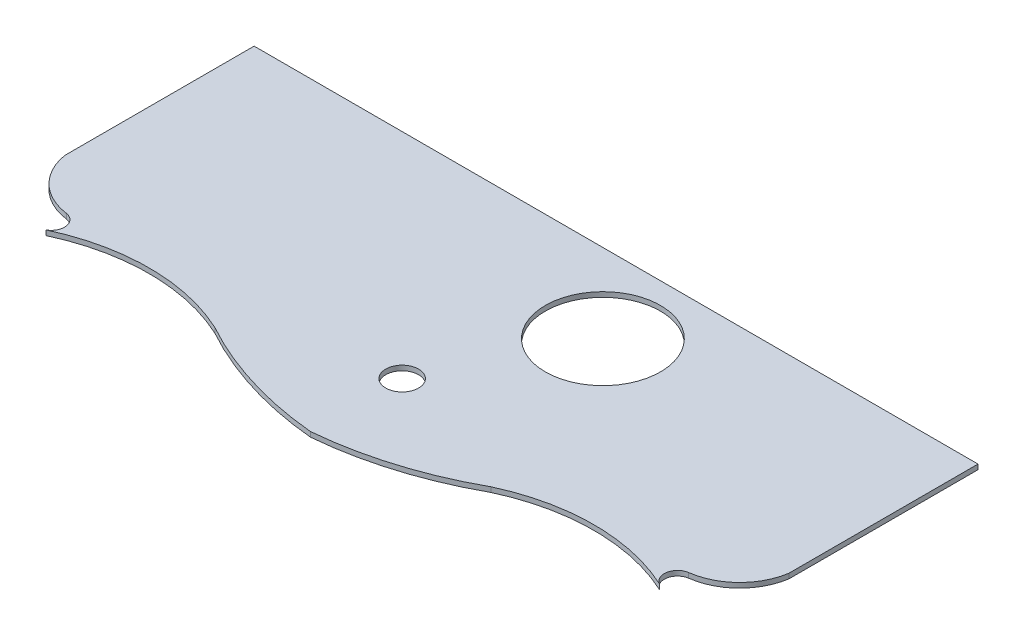
ISO-10303-21;
HEADER;
FILE_DESCRIPTION(('STEP AP214'),'2;1');
FILE_NAME('part.step','',(''),(''),'','','');
FILE_SCHEMA(('AUTOMOTIVE_DESIGN { 1 0 10303 214 1 1 1 1 }'));
ENDSEC;
DATA;
#1=APPLICATION_CONTEXT('core data for automotive mechanical design processes');
#2=APPLICATION_PROTOCOL_DEFINITION('international standard','automotive_design',2000,#1);
#3=PRODUCT_CONTEXT('',#1,'mechanical');
#4=PRODUCT('Part','Part','',(#3));
#5=PRODUCT_RELATED_PRODUCT_CATEGORY('part','',(#4));
#6=PRODUCT_DEFINITION_FORMATION('','',#4);
#7=PRODUCT_DEFINITION_CONTEXT('part definition',#1,'design');
#8=PRODUCT_DEFINITION('design','',#6,#7);
#9=PRODUCT_DEFINITION_SHAPE('','',#8);
#10=(LENGTH_UNIT() NAMED_UNIT(*) SI_UNIT(.MILLI.,.METRE.));
#11=(NAMED_UNIT(*) PLANE_ANGLE_UNIT() SI_UNIT($,.RADIAN.));
#12=(NAMED_UNIT(*) SI_UNIT($,.STERADIAN.) SOLID_ANGLE_UNIT());
#13=UNCERTAINTY_MEASURE_WITH_UNIT(LENGTH_MEASURE(1.E-05),#10,'distance_accuracy_value','');
#14=(GEOMETRIC_REPRESENTATION_CONTEXT(3) GLOBAL_UNCERTAINTY_ASSIGNED_CONTEXT((#13)) GLOBAL_UNIT_ASSIGNED_CONTEXT((#10,
#11,#12)) REPRESENTATION_CONTEXT('',''));
#15=CARTESIAN_POINT('',(0.,0.,0.));
#16=DIRECTION('',(0.,0.,1.));
#17=DIRECTION('',(1.,0.,0.));
#18=AXIS2_PLACEMENT_3D('',#15,#16,#17);
#19=CARTESIAN_POINT('',(0.,262.801123672656,15.));
#20=DIRECTION('',(0.,-1.,0.));
#21=DIRECTION('',(0.,0.,-1.));
#22=AXIS2_PLACEMENT_3D('',#19,#20,#21);
#23=CYLINDRICAL_SURFACE('',#22,5.);
#24=CARTESIAN_POINT('',(0.,22.5,15.));
#25=DIRECTION('',(0.,1.,0.));
#26=DIRECTION('',(0.,0.,1.));
#27=AXIS2_PLACEMENT_3D('',#24,#25,#26);
#28=CIRCLE('',#27,5.);
#29=CARTESIAN_POINT('',(0.,22.5,20.));
#30=VERTEX_POINT('',#29);
#31=EDGE_CURVE('E173',#30,#30,#28,.T.);
#32=ORIENTED_EDGE('',*,*,#31,.F.);
#33=EDGE_LOOP('',(#32));
#34=FACE_BOUND('',#33,.T.);
#35=CARTESIAN_POINT('',(0.,24.,15.));
#36=DIRECTION('',(0.,1.,0.));
#37=DIRECTION('',(0.,0.,1.));
#38=AXIS2_PLACEMENT_3D('',#35,#36,#37);
#39=CIRCLE('',#38,5.);
#40=CARTESIAN_POINT('',(0.,24.,20.));
#41=VERTEX_POINT('',#40);
#42=EDGE_CURVE('E142',#41,#41,#39,.T.);
#43=ORIENTED_EDGE('',*,*,#42,.T.);
#44=EDGE_LOOP('',(#43));
#45=FACE_BOUND('',#44,.T.);
#46=ADVANCED_FACE('F39',(#34,#45),#23,.F.);
#47=CARTESIAN_POINT('',(-110.,262.801123672656,-50.));
#48=DIRECTION('',(0.,0.,1.));
#49=DIRECTION('',(1.,0.,0.));
#50=AXIS2_PLACEMENT_3D('',#47,#48,#49);
#51=PLANE('',#50);
#52=DIRECTION('',(-1.,0.,0.));
#53=VECTOR('',#52,1.);
#54=CARTESIAN_POINT('',(-110.,24.,-50.));
#55=LINE('',#54,#53);
#56=CARTESIAN_POINT('',(110.,24.,-50.));
#57=VERTEX_POINT('',#56);
#58=CARTESIAN_POINT('',(-110.,24.,-50.));
#59=VERTEX_POINT('',#58);
#60=EDGE_CURVE('E127',#57,#59,#55,.T.);
#61=ORIENTED_EDGE('',*,*,#60,.F.);
#62=DIRECTION('',(0.,-1.,0.));
#63=VECTOR('',#62,1.);
#64=CARTESIAN_POINT('',(110.,262.801123672656,-50.));
#65=LINE('',#64,#63);
#66=CARTESIAN_POINT('',(110.,22.5,-50.));
#67=VERTEX_POINT('',#66);
#68=EDGE_CURVE('E54',#57,#67,#65,.T.);
#69=ORIENTED_EDGE('',*,*,#68,.T.);
#70=DIRECTION('',(-1.,0.,0.));
#71=VECTOR('',#70,1.);
#72=CARTESIAN_POINT('',(-110.,22.5,-50.));
#73=LINE('',#72,#71);
#74=CARTESIAN_POINT('',(-110.,22.5,-50.));
#75=VERTEX_POINT('',#74);
#76=EDGE_CURVE('E129',#67,#75,#73,.T.);
#77=ORIENTED_EDGE('',*,*,#76,.T.);
#78=DIRECTION('',(0.,-1.,0.));
#79=VECTOR('',#78,1.);
#80=CARTESIAN_POINT('',(-110.,262.801123672656,-50.));
#81=LINE('',#80,#79);
#82=EDGE_CURVE('E125',#59,#75,#81,.T.);
#83=ORIENTED_EDGE('',*,*,#82,.F.);
#84=EDGE_LOOP('',(#61,#69,#77,#83));
#85=FACE_BOUND('',#84,.T.);
#86=ADVANCED_FACE('F122',(#85),#51,.F.);
#87=CARTESIAN_POINT('',(110.,262.801123672656,-50.));
#88=DIRECTION('',(-1.,0.,0.));
#89=DIRECTION('',(0.,0.,1.));
#90=AXIS2_PLACEMENT_3D('',#87,#88,#89);
#91=PLANE('',#90);
#92=DIRECTION('',(0.,0.,-1.));
#93=VECTOR('',#92,1.);
#94=CARTESIAN_POINT('',(110.,24.,-50.));
#95=LINE('',#94,#93);
#96=CARTESIAN_POINT('',(110.,24.,7.50000000000001));
#97=VERTEX_POINT('',#96);
#98=EDGE_CURVE('E143',#97,#57,#95,.T.);
#99=ORIENTED_EDGE('',*,*,#98,.F.);
#100=DIRECTION('',(0.,-1.,0.));
#101=VECTOR('',#100,1.);
#102=CARTESIAN_POINT('',(110.,262.801123672656,7.50000000000001));
#103=LINE('',#102,#101);
#104=CARTESIAN_POINT('',(110.,22.5,7.50000000000001));
#105=VERTEX_POINT('',#104);
#106=EDGE_CURVE('E204',#97,#105,#103,.T.);
#107=ORIENTED_EDGE('',*,*,#106,.T.);
#108=DIRECTION('',(0.,0.,-1.));
#109=VECTOR('',#108,1.);
#110=CARTESIAN_POINT('',(110.,22.5,-50.));
#111=LINE('',#110,#109);
#112=EDGE_CURVE('E199',#105,#67,#111,.T.);
#113=ORIENTED_EDGE('',*,*,#112,.T.);
#114=ORIENTED_EDGE('',*,*,#68,.F.);
#115=EDGE_LOOP('',(#99,#107,#113,#114));
#116=FACE_BOUND('',#115,.T.);
#117=ADVANCED_FACE('F252',(#116),#91,.F.);
#118=CARTESIAN_POINT('',(92.2220271706998,262.801123672656,4.68154615424299));
#119=DIRECTION('',(0.,-1.,0.));
#120=DIRECTION('',(0.,0.,-1.));
#121=AXIS2_PLACEMENT_3D('',#118,#119,#120);
#122=CYLINDRICAL_SURFACE('',#121,18.);
#123=CARTESIAN_POINT('',(92.2220271706998,24.,4.68154615424299));
#124=DIRECTION('',(0.,1.,0.));
#125=DIRECTION('',(0.,0.,1.));
#126=AXIS2_PLACEMENT_3D('',#123,#124,#125);
#127=CIRCLE('',#126,18.);
#128=CARTESIAN_POINT('',(94.5,24.,22.5368209992004));
#129=VERTEX_POINT('',#128);
#130=EDGE_CURVE('E145',#129,#97,#127,.T.);
#131=ORIENTED_EDGE('',*,*,#130,.F.);
#132=DIRECTION('',(0.,-1.,0.));
#133=VECTOR('',#132,1.);
#134=CARTESIAN_POINT('',(94.5,262.801123672656,22.5368209992004));
#135=LINE('',#134,#133);
#136=CARTESIAN_POINT('',(94.5,22.5,22.5368209992004));
#137=VERTEX_POINT('',#136);
#138=EDGE_CURVE('E206',#129,#137,#135,.T.);
#139=ORIENTED_EDGE('',*,*,#138,.T.);
#140=CARTESIAN_POINT('',(92.2220271706998,22.5,4.68154615424299));
#141=DIRECTION('',(0.,1.,0.));
#142=DIRECTION('',(0.,0.,-1.));
#143=AXIS2_PLACEMENT_3D('',#140,#141,#142);
#144=CIRCLE('',#143,18.);
#145=EDGE_CURVE('E197',#137,#105,#144,.T.);
#146=ORIENTED_EDGE('',*,*,#145,.T.);
#147=ORIENTED_EDGE('',*,*,#106,.F.);
#148=EDGE_LOOP('',(#131,#139,#146,#147));
#149=FACE_BOUND('',#148,.T.);
#150=ADVANCED_FACE('F247',(#149),#122,.T.);
#151=CARTESIAN_POINT('',(95.1559154698416,262.801123672656,26.4829496841931));
#152=DIRECTION('',(0.,-1.,0.));
#153=DIRECTION('',(0.,0.,-1.));
#154=AXIS2_PLACEMENT_3D('',#151,#152,#153);
#155=CYLINDRICAL_SURFACE('',#154,4.00026957867828);
#156=CARTESIAN_POINT('',(95.1559154698416,24.,26.4829496841931));
#157=DIRECTION('',(0.,1.,0.));
#158=DIRECTION('',(0.,0.,1.));
#159=AXIS2_PLACEMENT_3D('',#156,#157,#158);
#160=CIRCLE('',#159,4.00026957867828);
#161=CARTESIAN_POINT('',(93.25,24.,30.));
#162=VERTEX_POINT('',#161);
#163=EDGE_CURVE('E147',#162,#129,#160,.F.);
#164=ORIENTED_EDGE('',*,*,#163,.F.);
#165=DIRECTION('',(0.,-1.,0.));
#166=VECTOR('',#165,1.);
#167=CARTESIAN_POINT('',(93.25,262.801123672656,30.));
#168=LINE('',#167,#166);
#169=CARTESIAN_POINT('',(93.25,22.5,30.));
#170=VERTEX_POINT('',#169);
#171=EDGE_CURVE('E208',#162,#170,#168,.T.);
#172=ORIENTED_EDGE('',*,*,#171,.T.);
#173=CARTESIAN_POINT('',(95.1559154698416,22.5,26.4829496841931));
#174=DIRECTION('',(0.,-1.,0.));
#175=DIRECTION('',(0.,0.,1.));
#176=AXIS2_PLACEMENT_3D('',#173,#174,#175);
#177=CIRCLE('',#176,4.00026957867828);
#178=EDGE_CURVE('E192',#170,#137,#177,.T.);
#179=ORIENTED_EDGE('',*,*,#178,.T.);
#180=ORIENTED_EDGE('',*,*,#138,.F.);
#181=EDGE_LOOP('',(#164,#172,#179,#180));
#182=FACE_BOUND('',#181,.T.);
#183=ADVANCED_FACE('F246',(#182),#155,.F.);
#184=CARTESIAN_POINT('',(67.6062576231202,262.801123672656,85.029602130527));
#185=DIRECTION('',(0.,-1.,0.));
#186=DIRECTION('',(0.,0.,-1.));
#187=AXIS2_PLACEMENT_3D('',#184,#185,#186);
#188=CYLINDRICAL_SURFACE('',#187,60.7112727072649);
#189=CARTESIAN_POINT('',(67.6062576231202,24.,85.029602130527));
#190=DIRECTION('',(0.,1.,0.));
#191=DIRECTION('',(0.,0.,1.));
#192=AXIS2_PLACEMENT_3D('',#189,#190,#191);
#193=CIRCLE('',#192,60.7112727072649);
#194=CARTESIAN_POINT('',(41.9625152462405,24.,30.));
#195=VERTEX_POINT('',#194);
#196=EDGE_CURVE('E153',#195,#162,#193,.F.);
#197=ORIENTED_EDGE('',*,*,#196,.F.);
#198=DIRECTION('',(0.,-1.,0.));
#199=VECTOR('',#198,1.);
#200=CARTESIAN_POINT('',(41.9625152462405,262.801123672656,30.));
#201=LINE('',#200,#199);
#202=CARTESIAN_POINT('',(41.9625152462405,22.5,30.));
#203=VERTEX_POINT('',#202);
#204=EDGE_CURVE('E209',#195,#203,#201,.T.);
#205=ORIENTED_EDGE('',*,*,#204,.T.);
#206=CARTESIAN_POINT('',(67.6062576231202,22.5,85.029602130527));
#207=DIRECTION('',(0.,-1.,0.));
#208=DIRECTION('',(0.,0.,1.));
#209=AXIS2_PLACEMENT_3D('',#206,#207,#208);
#210=CIRCLE('',#209,60.7112727072649);
#211=EDGE_CURVE('E191',#203,#170,#210,.T.);
#212=ORIENTED_EDGE('',*,*,#211,.T.);
#213=ORIENTED_EDGE('',*,*,#171,.F.);
#214=EDGE_LOOP('',(#197,#205,#212,#213));
#215=FACE_BOUND('',#214,.T.);
#216=ADVANCED_FACE('F243',(#215),#188,.F.);
#217=CARTESIAN_POINT('',(-9.52483016864245,262.801123672656,-62.9793470940987));
#218=DIRECTION('',(0.,-1.,0.));
#219=DIRECTION('',(0.,0.,-1.));
#220=AXIS2_PLACEMENT_3D('',#217,#218,#219);
#221=CYLINDRICAL_SURFACE('',#220,106.283139415038);
#222=CARTESIAN_POINT('',(-9.52483016864245,24.,-62.9793470940987));
#223=DIRECTION('',(0.,1.,0.));
#224=DIRECTION('',(0.,0.,1.));
#225=AXIS2_PLACEMENT_3D('',#222,#223,#224);
#226=CIRCLE('',#225,106.283139415038);
#227=CARTESIAN_POINT('',(0.,24.,42.8761361562973));
#228=VERTEX_POINT('',#227);
#229=EDGE_CURVE('E156',#228,#195,#226,.T.);
#230=ORIENTED_EDGE('',*,*,#229,.F.);
#231=DIRECTION('',(0.,-1.,0.));
#232=VECTOR('',#231,1.);
#233=CARTESIAN_POINT('',(0.,262.801123672656,42.8761361562973));
#234=LINE('',#233,#232);
#235=CARTESIAN_POINT('',(0.,22.5,42.8761361562973));
#236=VERTEX_POINT('',#235);
#237=EDGE_CURVE('E215',#228,#236,#234,.T.);
#238=ORIENTED_EDGE('',*,*,#237,.T.);
#239=CARTESIAN_POINT('',(-9.52483016864245,22.5,-62.9793470940987));
#240=DIRECTION('',(0.,1.,0.));
#241=DIRECTION('',(0.,0.,-1.));
#242=AXIS2_PLACEMENT_3D('',#239,#240,#241);
#243=CIRCLE('',#242,106.283139415038);
#244=EDGE_CURVE('E186',#236,#203,#243,.T.);
#245=ORIENTED_EDGE('',*,*,#244,.T.);
#246=ORIENTED_EDGE('',*,*,#204,.F.);
#247=EDGE_LOOP('',(#230,#238,#245,#246));
#248=FACE_BOUND('',#247,.T.);
#249=ADVANCED_FACE('F240',(#248),#221,.T.);
#250=CARTESIAN_POINT('',(9.52483016864245,262.801123672656,-62.9793470940987));
#251=DIRECTION('',(0.,-1.,0.));
#252=DIRECTION('',(0.,0.,-1.));
#253=AXIS2_PLACEMENT_3D('',#250,#251,#252);
#254=CYLINDRICAL_SURFACE('',#253,106.283139415038);
#255=CARTESIAN_POINT('',(9.52483016864245,24.,-62.9793470940987));
#256=DIRECTION('',(0.,1.,0.));
#257=DIRECTION('',(0.,0.,1.));
#258=AXIS2_PLACEMENT_3D('',#255,#256,#257);
#259=CIRCLE('',#258,106.283139415038);
#260=CARTESIAN_POINT('',(-41.9625152462405,24.,30.));
#261=VERTEX_POINT('',#260);
#262=EDGE_CURVE('E157',#261,#228,#259,.T.);
#263=ORIENTED_EDGE('',*,*,#262,.F.);
#264=DIRECTION('',(0.,-1.,0.));
#265=VECTOR('',#264,1.);
#266=CARTESIAN_POINT('',(-41.9625152462405,262.801123672656,30.));
#267=LINE('',#266,#265);
#268=CARTESIAN_POINT('',(-41.9625152462405,22.5,30.));
#269=VERTEX_POINT('',#268);
#270=EDGE_CURVE('E212',#261,#269,#267,.T.);
#271=ORIENTED_EDGE('',*,*,#270,.T.);
#272=CARTESIAN_POINT('',(9.52483016864245,22.5,-62.9793470940987));
#273=DIRECTION('',(0.,1.,0.));
#274=DIRECTION('',(0.,0.,1.));
#275=AXIS2_PLACEMENT_3D('',#272,#273,#274);
#276=CIRCLE('',#275,106.283139415038);
#277=EDGE_CURVE('E183',#269,#236,#276,.T.);
#278=ORIENTED_EDGE('',*,*,#277,.T.);
#279=ORIENTED_EDGE('',*,*,#237,.F.);
#280=EDGE_LOOP('',(#263,#271,#278,#279));
#281=FACE_BOUND('',#280,.T.);
#282=ADVANCED_FACE('F234',(#281),#254,.T.);
#283=CARTESIAN_POINT('',(-67.6062576231202,262.801123672656,85.029602130527));
#284=DIRECTION('',(0.,-1.,0.));
#285=DIRECTION('',(0.,0.,-1.));
#286=AXIS2_PLACEMENT_3D('',#283,#284,#285);
#287=CYLINDRICAL_SURFACE('',#286,60.7112727072649);
#288=CARTESIAN_POINT('',(-67.6062576231202,24.,85.029602130527));
#289=DIRECTION('',(0.,1.,0.));
#290=DIRECTION('',(0.,0.,1.));
#291=AXIS2_PLACEMENT_3D('',#288,#289,#290);
#292=CIRCLE('',#291,60.7112727072649);
#293=CARTESIAN_POINT('',(-93.25,24.,30.));
#294=VERTEX_POINT('',#293);
#295=EDGE_CURVE('E165',#294,#261,#292,.F.);
#296=ORIENTED_EDGE('',*,*,#295,.F.);
#297=DIRECTION('',(0.,-1.,0.));
#298=VECTOR('',#297,1.);
#299=CARTESIAN_POINT('',(-93.25,262.801123672656,30.));
#300=LINE('',#299,#298);
#301=CARTESIAN_POINT('',(-93.25,22.5,30.));
#302=VERTEX_POINT('',#301);
#303=EDGE_CURVE('E216',#294,#302,#300,.T.);
#304=ORIENTED_EDGE('',*,*,#303,.T.);
#305=CARTESIAN_POINT('',(-67.6062576231202,22.5,85.029602130527));
#306=DIRECTION('',(0.,-1.,0.));
#307=DIRECTION('',(0.,0.,1.));
#308=AXIS2_PLACEMENT_3D('',#305,#306,#307);
#309=CIRCLE('',#308,60.7112727072649);
#310=EDGE_CURVE('E185',#302,#269,#309,.T.);
#311=ORIENTED_EDGE('',*,*,#310,.T.);
#312=ORIENTED_EDGE('',*,*,#270,.F.);
#313=EDGE_LOOP('',(#296,#304,#311,#312));
#314=FACE_BOUND('',#313,.T.);
#315=ADVANCED_FACE('F235',(#314),#287,.F.);
#316=CARTESIAN_POINT('',(-95.1559154698416,262.801123672656,26.4829496841931));
#317=DIRECTION('',(0.,-1.,0.));
#318=DIRECTION('',(0.,0.,-1.));
#319=AXIS2_PLACEMENT_3D('',#316,#317,#318);
#320=CYLINDRICAL_SURFACE('',#319,4.0002695786783);
#321=CARTESIAN_POINT('',(-95.1559154698416,24.,26.4829496841931));
#322=DIRECTION('',(0.,1.,0.));
#323=DIRECTION('',(0.,0.,1.));
#324=AXIS2_PLACEMENT_3D('',#321,#322,#323);
#325=CIRCLE('',#324,4.0002695786783);
#326=CARTESIAN_POINT('',(-94.5,24.,22.5368209992005));
#327=VERTEX_POINT('',#326);
#328=EDGE_CURVE('E164',#327,#294,#325,.F.);
#329=ORIENTED_EDGE('',*,*,#328,.F.);
#330=DIRECTION('',(0.,-1.,0.));
#331=VECTOR('',#330,1.);
#332=CARTESIAN_POINT('',(-94.5,262.801123672656,22.5368209992005));
#333=LINE('',#332,#331);
#334=CARTESIAN_POINT('',(-94.5,22.5,22.5368209992005));
#335=VERTEX_POINT('',#334);
#336=EDGE_CURVE('E48',#327,#335,#333,.T.);
#337=ORIENTED_EDGE('',*,*,#336,.T.);
#338=CARTESIAN_POINT('',(-95.1559154698416,22.5,26.4829496841931));
#339=DIRECTION('',(0.,-1.,0.));
#340=DIRECTION('',(0.,0.,-1.));
#341=AXIS2_PLACEMENT_3D('',#338,#339,#340);
#342=CIRCLE('',#341,4.0002695786783);
#343=EDGE_CURVE('E177',#335,#302,#342,.T.);
#344=ORIENTED_EDGE('',*,*,#343,.T.);
#345=ORIENTED_EDGE('',*,*,#303,.F.);
#346=EDGE_LOOP('',(#329,#337,#344,#345));
#347=FACE_BOUND('',#346,.T.);
#348=ADVANCED_FACE('F218',(#347),#320,.F.);
#349=CARTESIAN_POINT('',(-92.2220271706998,262.801123672656,4.68154615424301));
#350=DIRECTION('',(0.,-1.,0.));
#351=DIRECTION('',(0.,0.,-1.));
#352=AXIS2_PLACEMENT_3D('',#349,#350,#351);
#353=CYLINDRICAL_SURFACE('',#352,18.);
#354=CARTESIAN_POINT('',(-92.2220271706998,24.,4.68154615424301));
#355=DIRECTION('',(0.,1.,0.));
#356=DIRECTION('',(0.,0.,1.));
#357=AXIS2_PLACEMENT_3D('',#354,#355,#356);
#358=CIRCLE('',#357,18.);
#359=CARTESIAN_POINT('',(-110.,24.,7.5));
#360=VERTEX_POINT('',#359);
#361=EDGE_CURVE('E65',#360,#327,#358,.T.);
#362=ORIENTED_EDGE('',*,*,#361,.F.);
#363=DIRECTION('',(0.,-1.,0.));
#364=VECTOR('',#363,1.);
#365=CARTESIAN_POINT('',(-110.,262.801123672656,7.5));
#366=LINE('',#365,#364);
#367=CARTESIAN_POINT('',(-110.,22.5,7.5));
#368=VERTEX_POINT('',#367);
#369=EDGE_CURVE('E11',#360,#368,#366,.T.);
#370=ORIENTED_EDGE('',*,*,#369,.T.);
#371=CARTESIAN_POINT('',(-92.2220271706998,22.5,4.68154615424301));
#372=DIRECTION('',(0.,1.,0.));
#373=DIRECTION('',(0.,0.,1.));
#374=AXIS2_PLACEMENT_3D('',#371,#372,#373);
#375=CIRCLE('',#374,18.);
#376=EDGE_CURVE('E176',#368,#335,#375,.T.);
#377=ORIENTED_EDGE('',*,*,#376,.T.);
#378=ORIENTED_EDGE('',*,*,#336,.F.);
#379=EDGE_LOOP('',(#362,#370,#377,#378));
#380=FACE_BOUND('',#379,.T.);
#381=ADVANCED_FACE('F221',(#380),#353,.T.);
#382=CARTESIAN_POINT('',(-110.,262.801123672656,-50.));
#383=DIRECTION('',(1.,0.,0.));
#384=DIRECTION('',(0.,0.,-1.));
#385=AXIS2_PLACEMENT_3D('',#382,#383,#384);
#386=PLANE('',#385);
#387=DIRECTION('',(0.,0.,1.));
#388=VECTOR('',#387,1.);
#389=CARTESIAN_POINT('',(-110.,24.,-50.));
#390=LINE('',#389,#388);
#391=EDGE_CURVE('E134',#59,#360,#390,.T.);
#392=ORIENTED_EDGE('',*,*,#391,.F.);
#393=ORIENTED_EDGE('',*,*,#82,.T.);
#394=DIRECTION('',(0.,0.,1.));
#395=VECTOR('',#394,1.);
#396=CARTESIAN_POINT('',(-110.,22.5,-50.));
#397=LINE('',#396,#395);
#398=EDGE_CURVE('E172',#75,#368,#397,.T.);
#399=ORIENTED_EDGE('',*,*,#398,.T.);
#400=ORIENTED_EDGE('',*,*,#369,.F.);
#401=EDGE_LOOP('',(#392,#393,#399,#400));
#402=FACE_BOUND('',#401,.T.);
#403=ADVANCED_FACE('F41',(#402),#386,.F.);
#404=CARTESIAN_POINT('',(-92.2220271706998,22.5,4.68154615424301));
#405=DIRECTION('',(0.,1.,0.));
#406=DIRECTION('',(0.,0.,1.));
#407=AXIS2_PLACEMENT_3D('',#404,#405,#406);
#408=PLANE('',#407);
#409=ORIENTED_EDGE('',*,*,#398,.F.);
#410=ORIENTED_EDGE('',*,*,#76,.F.);
#411=ORIENTED_EDGE('',*,*,#112,.F.);
#412=ORIENTED_EDGE('',*,*,#145,.F.);
#413=ORIENTED_EDGE('',*,*,#178,.F.);
#414=ORIENTED_EDGE('',*,*,#211,.F.);
#415=ORIENTED_EDGE('',*,*,#244,.F.);
#416=ORIENTED_EDGE('',*,*,#277,.F.);
#417=ORIENTED_EDGE('',*,*,#310,.F.);
#418=ORIENTED_EDGE('',*,*,#343,.F.);
#419=ORIENTED_EDGE('',*,*,#376,.F.);
#420=EDGE_LOOP('',(#409,#410,#411,#412,#413,#414,#415,#416,#417,#418,#419));
#421=FACE_BOUND('',#420,.T.);
#422=ORIENTED_EDGE('',*,*,#31,.T.);
#423=EDGE_LOOP('',(#422));
#424=FACE_BOUND('',#423,.T.);
#425=CARTESIAN_POINT('',(20.,22.5,-26.));
#426=DIRECTION('',(0.,1.,0.));
#427=DIRECTION('',(0.,0.,1.));
#428=AXIS2_PLACEMENT_3D('',#425,#426,#427);
#429=CIRCLE('',#428,17.5);
#430=CARTESIAN_POINT('',(20.,22.5,-8.49999999999999));
#431=VERTEX_POINT('',#430);
#432=EDGE_CURVE('E140',#431,#431,#429,.T.);
#433=ORIENTED_EDGE('',*,*,#432,.T.);
#434=EDGE_LOOP('',(#433));
#435=FACE_BOUND('',#434,.T.);
#436=ADVANCED_FACE('F228',(#421,#424,#435),#408,.F.);
#437=CARTESIAN_POINT('',(20.,262.801123672656,-26.));
#438=DIRECTION('',(0.,-1.,0.));
#439=DIRECTION('',(0.,0.,-1.));
#440=AXIS2_PLACEMENT_3D('',#437,#438,#439);
#441=CYLINDRICAL_SURFACE('',#440,17.5);
#442=ORIENTED_EDGE('',*,*,#432,.F.);
#443=EDGE_LOOP('',(#442));
#444=FACE_BOUND('',#443,.T.);
#445=CARTESIAN_POINT('',(20.,24.,-26.));
#446=DIRECTION('',(0.,1.,0.));
#447=DIRECTION('',(0.,0.,1.));
#448=AXIS2_PLACEMENT_3D('',#445,#446,#447);
#449=CIRCLE('',#448,17.5);
#450=CARTESIAN_POINT('',(20.,24.,-8.49999999999999));
#451=VERTEX_POINT('',#450);
#452=EDGE_CURVE('E43',#451,#451,#449,.T.);
#453=ORIENTED_EDGE('',*,*,#452,.T.);
#454=EDGE_LOOP('',(#453));
#455=FACE_BOUND('',#454,.T.);
#456=ADVANCED_FACE('F269',(#444,#455),#441,.F.);
#457=CARTESIAN_POINT('',(0.,24.,0.));
#458=DIRECTION('',(0.,1.,0.));
#459=DIRECTION('',(0.,0.,1.));
#460=AXIS2_PLACEMENT_3D('',#457,#458,#459);
#461=PLANE('',#460);
#462=ORIENTED_EDGE('',*,*,#452,.F.);
#463=EDGE_LOOP('',(#462));
#464=FACE_BOUND('',#463,.T.);
#465=ORIENTED_EDGE('',*,*,#42,.F.);
#466=EDGE_LOOP('',(#465));
#467=FACE_BOUND('',#466,.T.);
#468=ORIENTED_EDGE('',*,*,#60,.T.);
#469=ORIENTED_EDGE('',*,*,#391,.T.);
#470=ORIENTED_EDGE('',*,*,#361,.T.);
#471=ORIENTED_EDGE('',*,*,#328,.T.);
#472=ORIENTED_EDGE('',*,*,#295,.T.);
#473=ORIENTED_EDGE('',*,*,#262,.T.);
#474=ORIENTED_EDGE('',*,*,#229,.T.);
#475=ORIENTED_EDGE('',*,*,#196,.T.);
#476=ORIENTED_EDGE('',*,*,#163,.T.);
#477=ORIENTED_EDGE('',*,*,#130,.T.);
#478=ORIENTED_EDGE('',*,*,#98,.T.);
#479=EDGE_LOOP('',(#468,#469,#470,#471,#472,#473,#474,#475,#476,#477,#478));
#480=FACE_BOUND('',#479,.T.);
#481=ADVANCED_FACE('F137',(#464,#467,#480),#461,.T.);
#482=CLOSED_SHELL('',(#46,#86,#117,#150,#183,#216,#249,#282,#315,#348,#381,#403,#436,#456,#481));
#483=MANIFOLD_SOLID_BREP('B2',#482);
#484=ADVANCED_BREP_SHAPE_REPRESENTATION('',(#18,#483),#14);
#485=SHAPE_DEFINITION_REPRESENTATION(#9,#484);
ENDSEC;
END-ISO-10303-21;
